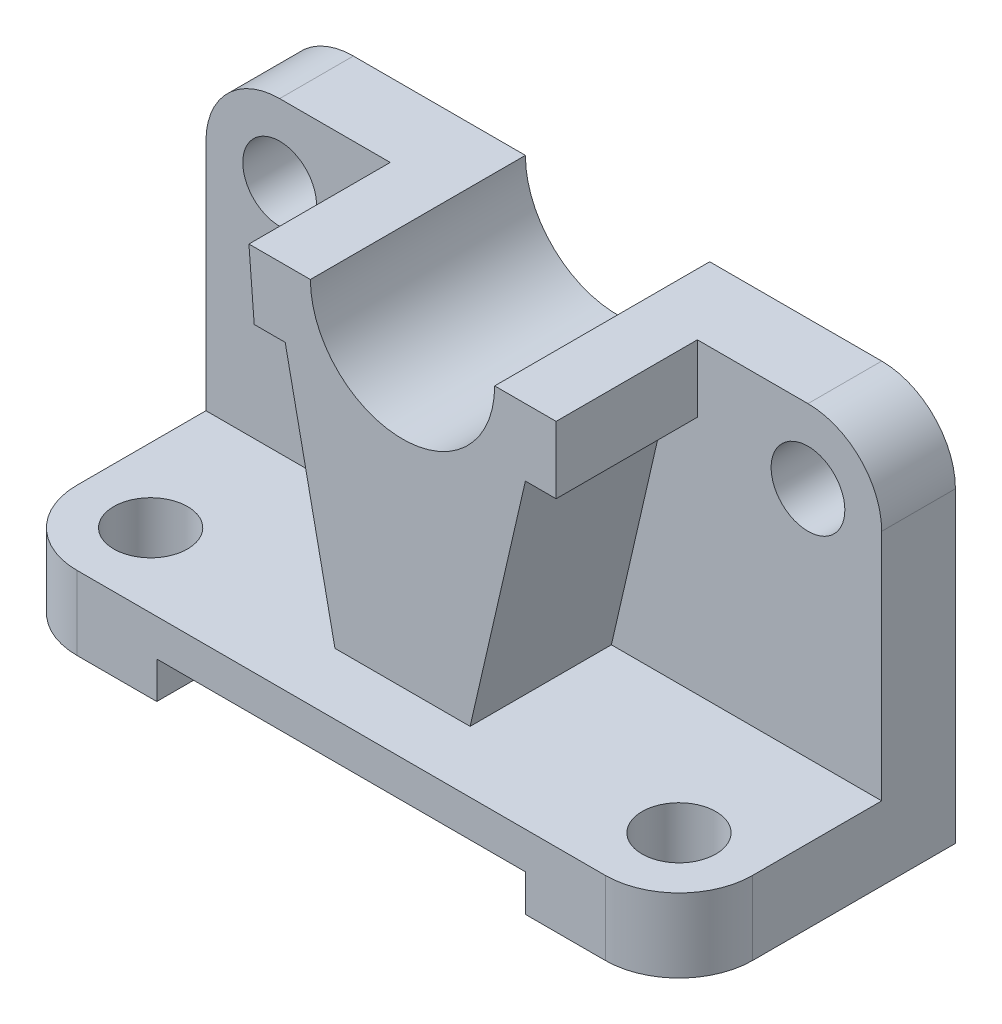
ISO-10303-21;
HEADER;
FILE_DESCRIPTION(('STEP AP214'),'2;1');
FILE_NAME('part.step','',(''),(''),'','','');
FILE_SCHEMA(('AUTOMOTIVE_DESIGN { 1 0 10303 214 1 1 1 1 }'));
ENDSEC;
DATA;
#1=APPLICATION_CONTEXT('core data for automotive mechanical design processes');
#2=APPLICATION_PROTOCOL_DEFINITION('international standard','automotive_design',2000,#1);
#3=PRODUCT_CONTEXT('',#1,'mechanical');
#4=PRODUCT('Part','Part','',(#3));
#5=PRODUCT_RELATED_PRODUCT_CATEGORY('part','',(#4));
#6=PRODUCT_DEFINITION_FORMATION('','',#4);
#7=PRODUCT_DEFINITION_CONTEXT('part definition',#1,'design');
#8=PRODUCT_DEFINITION('design','',#6,#7);
#9=PRODUCT_DEFINITION_SHAPE('','',#8);
#10=(LENGTH_UNIT() NAMED_UNIT(*) SI_UNIT(.MILLI.,.METRE.));
#11=(NAMED_UNIT(*) PLANE_ANGLE_UNIT() SI_UNIT($,.RADIAN.));
#12=(NAMED_UNIT(*) SI_UNIT($,.STERADIAN.) SOLID_ANGLE_UNIT());
#13=UNCERTAINTY_MEASURE_WITH_UNIT(LENGTH_MEASURE(1.E-05),#10,'distance_accuracy_value','');
#14=(GEOMETRIC_REPRESENTATION_CONTEXT(3) GLOBAL_UNCERTAINTY_ASSIGNED_CONTEXT((#13)) GLOBAL_UNIT_ASSIGNED_CONTEXT((#10,
#11,#12)) REPRESENTATION_CONTEXT('',''));
#15=CARTESIAN_POINT('',(0.,0.,0.));
#16=DIRECTION('',(0.,0.,1.));
#17=DIRECTION('',(1.,0.,0.));
#18=AXIS2_PLACEMENT_3D('',#15,#16,#17);
#19=CARTESIAN_POINT('',(110.,-62.,0.));
#20=DIRECTION('',(0.,1.,0.));
#21=DIRECTION('',(0.,0.,1.));
#22=AXIS2_PLACEMENT_3D('',#19,#20,#21);
#23=PLANE('',#22);
#24=CARTESIAN_POINT('',(12.,-62.,33.));
#25=DIRECTION('',(0.,1.,0.));
#26=DIRECTION('',(0.,0.,1.));
#27=AXIS2_PLACEMENT_3D('',#24,#25,#26);
#28=CIRCLE('',#27,6.);
#29=CARTESIAN_POINT('',(12.,-62.,39.));
#30=VERTEX_POINT('',#29);
#31=EDGE_CURVE('E210',#30,#30,#28,.T.);
#32=ORIENTED_EDGE('',*,*,#31,.T.);
#33=EDGE_LOOP('',(#32));
#34=FACE_BOUND('',#33,.T.);
#35=DIRECTION('',(-1.,0.,0.));
#36=VECTOR('',#35,1.);
#37=CARTESIAN_POINT('',(110.,-62.,45.));
#38=LINE('',#37,#36);
#39=CARTESIAN_POINT('',(25.,-62.,45.));
#40=VERTEX_POINT('',#39);
#41=CARTESIAN_POINT('',(12.,-62.,45.));
#42=VERTEX_POINT('',#41);
#43=EDGE_CURVE('E215',#40,#42,#38,.T.);
#44=ORIENTED_EDGE('',*,*,#43,.T.);
#45=CARTESIAN_POINT('',(12.,-62.,33.));
#46=DIRECTION('',(0.,1.,0.));
#47=DIRECTION('',(0.,0.,1.));
#48=AXIS2_PLACEMENT_3D('',#45,#46,#47);
#49=CIRCLE('',#48,12.);
#50=CARTESIAN_POINT('',(0.,-62.,33.));
#51=VERTEX_POINT('',#50);
#52=EDGE_CURVE('E266',#42,#51,#49,.F.);
#53=ORIENTED_EDGE('',*,*,#52,.T.);
#54=DIRECTION('',(0.,0.,-1.));
#55=VECTOR('',#54,1.);
#56=CARTESIAN_POINT('',(0.,-62.,0.));
#57=LINE('',#56,#55);
#58=CARTESIAN_POINT('',(0.,-62.,0.));
#59=VERTEX_POINT('',#58);
#60=EDGE_CURVE('E365',#51,#59,#57,.T.);
#61=ORIENTED_EDGE('',*,*,#60,.T.);
#62=DIRECTION('',(-1.,0.,0.));
#63=VECTOR('',#62,1.);
#64=CARTESIAN_POINT('',(110.,-62.,0.));
#65=LINE('',#64,#63);
#66=CARTESIAN_POINT('',(25.,-62.,0.));
#67=VERTEX_POINT('',#66);
#68=EDGE_CURVE('E217',#67,#59,#65,.T.);
#69=ORIENTED_EDGE('',*,*,#68,.F.);
#70=DIRECTION('',(0.,0.,1.));
#71=VECTOR('',#70,1.);
#72=CARTESIAN_POINT('',(25.,-62.,-108.));
#73=LINE('',#72,#71);
#74=EDGE_CURVE('E201',#67,#40,#73,.T.);
#75=ORIENTED_EDGE('',*,*,#74,.T.);
#76=EDGE_LOOP('',(#44,#53,#61,#69,#75));
#77=FACE_BOUND('',#76,.T.);
#78=ADVANCED_FACE('F39',(#34,#77),#23,.F.);
#79=CARTESIAN_POINT('',(110.,0.,12.));
#80=DIRECTION('',(0.,-1.,0.));
#81=DIRECTION('',(0.,0.,-1.));
#82=AXIS2_PLACEMENT_3D('',#79,#80,#81);
#83=PLANE('',#82);
#84=DIRECTION('',(-1.,0.,0.));
#85=VECTOR('',#84,1.);
#86=CARTESIAN_POINT('',(110.,0.,12.));
#87=LINE('',#86,#85);
#88=CARTESIAN_POINT('',(98.,0.,12.));
#89=VERTEX_POINT('',#88);
#90=CARTESIAN_POINT('',(80.,0.,12.));
#91=VERTEX_POINT('',#90);
#92=EDGE_CURVE('E241',#89,#91,#87,.T.);
#93=ORIENTED_EDGE('',*,*,#92,.F.);
#94=DIRECTION('',(0.,0.,1.));
#95=VECTOR('',#94,1.);
#96=CARTESIAN_POINT('',(98.,0.,12.));
#97=LINE('',#96,#95);
#98=CARTESIAN_POINT('',(98.,0.,0.));
#99=VERTEX_POINT('',#98);
#100=EDGE_CURVE('E280',#89,#99,#97,.F.);
#101=ORIENTED_EDGE('',*,*,#100,.T.);
#102=DIRECTION('',(-1.,0.,0.));
#103=VECTOR('',#102,1.);
#104=CARTESIAN_POINT('',(110.,0.,0.));
#105=LINE('',#104,#103);
#106=CARTESIAN_POINT('',(70.,0.,0.));
#107=VERTEX_POINT('',#106);
#108=EDGE_CURVE('E368',#99,#107,#105,.T.);
#109=ORIENTED_EDGE('',*,*,#108,.T.);
#110=DIRECTION('',(0.,0.,-1.));
#111=VECTOR('',#110,1.);
#112=CARTESIAN_POINT('',(70.,0.,35.));
#113=LINE('',#112,#111);
#114=CARTESIAN_POINT('',(70.,0.,35.));
#115=VERTEX_POINT('',#114);
#116=EDGE_CURVE('E327',#115,#107,#113,.T.);
#117=ORIENTED_EDGE('',*,*,#116,.F.);
#118=DIRECTION('',(-1.,0.,0.));
#119=VECTOR('',#118,1.);
#120=CARTESIAN_POINT('',(70.,0.,35.));
#121=LINE('',#120,#119);
#122=CARTESIAN_POINT('',(80.,0.,35.));
#123=VERTEX_POINT('',#122);
#124=EDGE_CURVE('E391',#123,#115,#121,.T.);
#125=ORIENTED_EDGE('',*,*,#124,.F.);
#126=DIRECTION('',(0.,0.,-1.));
#127=VECTOR('',#126,1.);
#128=CARTESIAN_POINT('',(80.,0.,35.));
#129=LINE('',#128,#127);
#130=EDGE_CURVE('E330',#123,#91,#129,.T.);
#131=ORIENTED_EDGE('',*,*,#130,.T.);
#132=EDGE_LOOP('',(#93,#101,#109,#117,#125,#131));
#133=FACE_BOUND('',#132,.T.);
#134=ADVANCED_FACE('F390',(#133),#83,.F.);
#135=CARTESIAN_POINT('',(110.,-50.,12.));
#136=DIRECTION('',(0.,0.,-1.));
#137=DIRECTION('',(0.,1.,0.));
#138=AXIS2_PLACEMENT_3D('',#135,#136,#137);
#139=PLANE('',#138);
#140=CARTESIAN_POINT('',(12.,-12.,12.));
#141=DIRECTION('',(0.,0.,-1.));
#142=DIRECTION('',(0.,1.,0.));
#143=AXIS2_PLACEMENT_3D('',#140,#141,#142);
#144=CIRCLE('',#143,6.);
#145=CARTESIAN_POINT('',(12.,-6.,12.));
#146=VERTEX_POINT('',#145);
#147=EDGE_CURVE('E423',#146,#146,#144,.T.);
#148=ORIENTED_EDGE('',*,*,#147,.T.);
#149=EDGE_LOOP('',(#148));
#150=FACE_BOUND('',#149,.T.);
#151=CARTESIAN_POINT('',(30.,0.,12.));
#152=VERTEX_POINT('',#151);
#153=CARTESIAN_POINT('',(12.,0.,12.));
#154=VERTEX_POINT('',#153);
#155=EDGE_CURVE('E240',#152,#154,#87,.T.);
#156=ORIENTED_EDGE('',*,*,#155,.T.);
#157=CARTESIAN_POINT('',(12.,-12.,12.));
#158=DIRECTION('',(0.,0.,-1.));
#159=DIRECTION('',(0.,1.,0.));
#160=AXIS2_PLACEMENT_3D('',#157,#158,#159);
#161=CIRCLE('',#160,12.);
#162=CARTESIAN_POINT('',(0.,-12.,12.));
#163=VERTEX_POINT('',#162);
#164=EDGE_CURVE('E48',#154,#163,#161,.F.);
#165=ORIENTED_EDGE('',*,*,#164,.T.);
#166=DIRECTION('',(0.,-1.,0.));
#167=VECTOR('',#166,1.);
#168=CARTESIAN_POINT('',(0.,-50.,12.));
#169=LINE('',#168,#167);
#170=CARTESIAN_POINT('',(0.,-50.,12.));
#171=VERTEX_POINT('',#170);
#172=EDGE_CURVE('E349',#163,#171,#169,.T.);
#173=ORIENTED_EDGE('',*,*,#172,.T.);
#174=DIRECTION('',(-1.,0.,0.));
#175=VECTOR('',#174,1.);
#176=CARTESIAN_POINT('',(110.,-50.,12.));
#177=LINE('',#176,#175);
#178=CARTESIAN_POINT('',(44.,-50.,12.));
#179=VERTEX_POINT('',#178);
#180=EDGE_CURVE('E236',#179,#171,#177,.T.);
#181=ORIENTED_EDGE('',*,*,#180,.F.);
#182=DIRECTION('',(0.202852451167821,-0.979209315241234,0.));
#183=VECTOR('',#182,1.);
#184=CARTESIAN_POINT('',(44.,-50.,12.));
#185=LINE('',#184,#183);
#186=CARTESIAN_POINT('',(35.9028376492862,-10.9133793789853,12.));
#187=VERTEX_POINT('',#186);
#188=EDGE_CURVE('E306',#187,#179,#185,.T.);
#189=ORIENTED_EDGE('',*,*,#188,.F.);
#190=DIRECTION('',(1.,0.,0.));
#191=VECTOR('',#190,1.);
#192=CARTESIAN_POINT('',(35.9028376492862,-10.9133793789853,12.));
#193=LINE('',#192,#191);
#194=CARTESIAN_POINT('',(30.8555150734653,-10.9133793789853,12.));
#195=VERTEX_POINT('',#194);
#196=EDGE_CURVE('E302',#195,#187,#193,.T.);
#197=ORIENTED_EDGE('',*,*,#196,.F.);
#198=DIRECTION('',(0.0781516372618264,-0.996941483535165,0.));
#199=VECTOR('',#198,1.);
#200=CARTESIAN_POINT('',(30.8555150734653,-10.9133793789853,12.));
#201=LINE('',#200,#199);
#202=EDGE_CURVE('E300',#152,#195,#201,.T.);
#203=ORIENTED_EDGE('',*,*,#202,.F.);
#204=EDGE_LOOP('',(#156,#165,#173,#181,#189,#197,#203));
#205=FACE_BOUND('',#204,.T.);
#206=ADVANCED_FACE('F297',(#150,#205),#139,.F.);
#207=CARTESIAN_POINT('',(98.,-12.,12.));
#208=DIRECTION('',(0.,0.,1.));
#209=DIRECTION('',(1.,0.,0.));
#210=AXIS2_PLACEMENT_3D('',#207,#208,#209);
#211=CIRCLE('',#210,6.);
#212=CARTESIAN_POINT('',(104.,-12.,12.));
#213=VERTEX_POINT('',#212);
#214=EDGE_CURVE('E429',#213,#213,#211,.T.);
#215=ORIENTED_EDGE('',*,*,#214,.F.);
#216=EDGE_LOOP('',(#215));
#217=FACE_BOUND('',#216,.T.);
#218=DIRECTION('',(0.,-1.,0.));
#219=VECTOR('',#218,1.);
#220=CARTESIAN_POINT('',(110.,-50.,12.));
#221=LINE('',#220,#219);
#222=CARTESIAN_POINT('',(110.,-12.,12.));
#223=VERTEX_POINT('',#222);
#224=CARTESIAN_POINT('',(110.,-50.,12.));
#225=VERTEX_POINT('',#224);
#226=EDGE_CURVE('E350',#223,#225,#221,.T.);
#227=ORIENTED_EDGE('',*,*,#226,.F.);
#228=CARTESIAN_POINT('',(98.,-12.,12.));
#229=DIRECTION('',(0.,0.,-1.));
#230=DIRECTION('',(0.,1.,0.));
#231=AXIS2_PLACEMENT_3D('',#228,#229,#230);
#232=CIRCLE('',#231,12.);
#233=EDGE_CURVE('E278',#223,#89,#232,.F.);
#234=ORIENTED_EDGE('',*,*,#233,.T.);
#235=ORIENTED_EDGE('',*,*,#92,.T.);
#236=DIRECTION('',(0.,1.,0.));
#237=VECTOR('',#236,1.);
#238=CARTESIAN_POINT('',(80.,0.,12.));
#239=LINE('',#238,#237);
#240=CARTESIAN_POINT('',(80.,-10.9133793789853,12.));
#241=VERTEX_POINT('',#240);
#242=EDGE_CURVE('E319',#241,#91,#239,.T.);
#243=ORIENTED_EDGE('',*,*,#242,.F.);
#244=DIRECTION('',(1.,0.,0.));
#245=VECTOR('',#244,1.);
#246=CARTESIAN_POINT('',(80.,-10.9133793789853,12.));
#247=LINE('',#246,#245);
#248=CARTESIAN_POINT('',(75.,-10.9133793789853,12.));
#249=VERTEX_POINT('',#248);
#250=EDGE_CURVE('E317',#249,#241,#247,.T.);
#251=ORIENTED_EDGE('',*,*,#250,.F.);
#252=DIRECTION('',(0.22438630742042,0.974500274521372,0.));
#253=VECTOR('',#252,1.);
#254=CARTESIAN_POINT('',(75.,-10.9133793789853,12.));
#255=LINE('',#254,#253);
#256=CARTESIAN_POINT('',(66.,-50.,12.));
#257=VERTEX_POINT('',#256);
#258=EDGE_CURVE('E315',#257,#249,#255,.T.);
#259=ORIENTED_EDGE('',*,*,#258,.F.);
#260=EDGE_CURVE('E237',#225,#257,#177,.T.);
#261=ORIENTED_EDGE('',*,*,#260,.F.);
#262=EDGE_LOOP('',(#227,#234,#235,#243,#251,#259,#261));
#263=FACE_BOUND('',#262,.T.);
#264=ADVANCED_FACE('F611',(#217,#263),#139,.F.);
#265=CARTESIAN_POINT('',(110.,-50.,45.));
#266=DIRECTION('',(0.,-1.,0.));
#267=DIRECTION('',(0.,0.,-1.));
#268=AXIS2_PLACEMENT_3D('',#265,#266,#267);
#269=PLANE('',#268);
#270=CARTESIAN_POINT('',(98.,-50.,33.));
#271=DIRECTION('',(0.,-1.,0.));
#272=DIRECTION('',(0.,0.,1.));
#273=AXIS2_PLACEMENT_3D('',#270,#271,#272);
#274=CIRCLE('',#273,6.);
#275=CARTESIAN_POINT('',(98.,-50.,39.));
#276=VERTEX_POINT('',#275);
#277=EDGE_CURVE('E275',#276,#276,#274,.T.);
#278=ORIENTED_EDGE('',*,*,#277,.T.);
#279=EDGE_LOOP('',(#278));
#280=FACE_BOUND('',#279,.T.);
#281=CARTESIAN_POINT('',(12.,-50.,33.));
#282=DIRECTION('',(0.,1.,0.));
#283=DIRECTION('',(0.,0.,1.));
#284=AXIS2_PLACEMENT_3D('',#281,#282,#283);
#285=CIRCLE('',#284,6.);
#286=CARTESIAN_POINT('',(12.,-50.,39.));
#287=VERTEX_POINT('',#286);
#288=EDGE_CURVE('E274',#287,#287,#285,.T.);
#289=ORIENTED_EDGE('',*,*,#288,.F.);
#290=EDGE_LOOP('',(#289));
#291=FACE_BOUND('',#290,.T.);
#292=DIRECTION('',(-1.,0.,0.));
#293=VECTOR('',#292,1.);
#294=CARTESIAN_POINT('',(110.,-50.,45.));
#295=LINE('',#294,#293);
#296=CARTESIAN_POINT('',(98.,-50.,45.));
#297=VERTEX_POINT('',#296);
#298=CARTESIAN_POINT('',(12.,-50.,45.));
#299=VERTEX_POINT('',#298);
#300=EDGE_CURVE('E230',#297,#299,#295,.T.);
#301=ORIENTED_EDGE('',*,*,#300,.F.);
#302=CARTESIAN_POINT('',(98.,-50.,33.));
#303=DIRECTION('',(0.,-1.,0.));
#304=DIRECTION('',(0.,0.,-1.));
#305=AXIS2_PLACEMENT_3D('',#302,#303,#304);
#306=CIRCLE('',#305,12.);
#307=CARTESIAN_POINT('',(110.,-50.,33.));
#308=VERTEX_POINT('',#307);
#309=EDGE_CURVE('E264',#297,#308,#306,.F.);
#310=ORIENTED_EDGE('',*,*,#309,.T.);
#311=DIRECTION('',(0.,0.,1.));
#312=VECTOR('',#311,1.);
#313=CARTESIAN_POINT('',(110.,-50.,45.));
#314=LINE('',#313,#312);
#315=EDGE_CURVE('E352',#225,#308,#314,.T.);
#316=ORIENTED_EDGE('',*,*,#315,.F.);
#317=ORIENTED_EDGE('',*,*,#260,.T.);
#318=DIRECTION('',(0.,0.,-1.));
#319=VECTOR('',#318,1.);
#320=CARTESIAN_POINT('',(66.,-50.,35.));
#321=LINE('',#320,#319);
#322=CARTESIAN_POINT('',(66.,-50.,35.));
#323=VERTEX_POINT('',#322);
#324=EDGE_CURVE('E339',#323,#257,#321,.T.);
#325=ORIENTED_EDGE('',*,*,#324,.F.);
#326=DIRECTION('',(1.,0.,0.));
#327=VECTOR('',#326,1.);
#328=CARTESIAN_POINT('',(66.,-50.,35.));
#329=LINE('',#328,#327);
#330=CARTESIAN_POINT('',(44.,-50.,35.));
#331=VERTEX_POINT('',#330);
#332=EDGE_CURVE('E402',#331,#323,#329,.T.);
#333=ORIENTED_EDGE('',*,*,#332,.F.);
#334=DIRECTION('',(0.,0.,-1.));
#335=VECTOR('',#334,1.);
#336=CARTESIAN_POINT('',(44.,-50.,35.));
#337=LINE('',#336,#335);
#338=EDGE_CURVE('E341',#331,#179,#337,.T.);
#339=ORIENTED_EDGE('',*,*,#338,.T.);
#340=ORIENTED_EDGE('',*,*,#180,.T.);
#341=DIRECTION('',(0.,0.,1.));
#342=VECTOR('',#341,1.);
#343=CARTESIAN_POINT('',(0.,-50.,45.));
#344=LINE('',#343,#342);
#345=CARTESIAN_POINT('',(0.,-50.,33.));
#346=VERTEX_POINT('',#345);
#347=EDGE_CURVE('E362',#171,#346,#344,.T.);
#348=ORIENTED_EDGE('',*,*,#347,.T.);
#349=CARTESIAN_POINT('',(12.,-50.,33.));
#350=DIRECTION('',(0.,-1.,0.));
#351=DIRECTION('',(0.,0.,-1.));
#352=AXIS2_PLACEMENT_3D('',#349,#350,#351);
#353=CIRCLE('',#352,12.);
#354=EDGE_CURVE('E262',#346,#299,#353,.F.);
#355=ORIENTED_EDGE('',*,*,#354,.T.);
#356=EDGE_LOOP('',(#301,#310,#316,#317,#325,#333,#339,#340,#348,#355));
#357=FACE_BOUND('',#356,.T.);
#358=ADVANCED_FACE('F485',(#280,#291,#357),#269,.F.);
#359=CARTESIAN_POINT('',(40.,0.,0.));
#360=VERTEX_POINT('',#359);
#361=CARTESIAN_POINT('',(12.,0.,0.));
#362=VERTEX_POINT('',#361);
#363=EDGE_CURVE('E294',#360,#362,#105,.T.);
#364=ORIENTED_EDGE('',*,*,#363,.T.);
#365=DIRECTION('',(0.,0.,1.));
#366=VECTOR('',#365,1.);
#367=CARTESIAN_POINT('',(12.,0.,12.));
#368=LINE('',#367,#366);
#369=EDGE_CURVE('E286',#362,#154,#368,.T.);
#370=ORIENTED_EDGE('',*,*,#369,.T.);
#371=ORIENTED_EDGE('',*,*,#155,.F.);
#372=DIRECTION('',(0.,0.,-1.));
#373=VECTOR('',#372,1.);
#374=CARTESIAN_POINT('',(30.,0.,35.));
#375=LINE('',#374,#373);
#376=CARTESIAN_POINT('',(30.,0.,35.));
#377=VERTEX_POINT('',#376);
#378=EDGE_CURVE('E323',#377,#152,#375,.T.);
#379=ORIENTED_EDGE('',*,*,#378,.F.);
#380=DIRECTION('',(-1.,0.,0.));
#381=VECTOR('',#380,1.);
#382=CARTESIAN_POINT('',(30.,0.,35.));
#383=LINE('',#382,#381);
#384=CARTESIAN_POINT('',(40.,0.,35.));
#385=VERTEX_POINT('',#384);
#386=EDGE_CURVE('E311',#385,#377,#383,.T.);
#387=ORIENTED_EDGE('',*,*,#386,.F.);
#388=DIRECTION('',(0.,0.,-1.));
#389=VECTOR('',#388,1.);
#390=CARTESIAN_POINT('',(40.,0.,35.));
#391=LINE('',#390,#389);
#392=EDGE_CURVE('E325',#385,#360,#391,.T.);
#393=ORIENTED_EDGE('',*,*,#392,.T.);
#394=EDGE_LOOP('',(#364,#370,#371,#379,#387,#393));
#395=FACE_BOUND('',#394,.T.);
#396=ADVANCED_FACE('F291',(#395),#83,.F.);
#397=CARTESIAN_POINT('',(110.,-62.,45.));
#398=DIRECTION('',(0.,0.,-1.));
#399=DIRECTION('',(-1.,0.,0.));
#400=AXIS2_PLACEMENT_3D('',#397,#398,#399);
#401=PLANE('',#400);
#402=CARTESIAN_POINT('',(98.,-62.,45.));
#403=VERTEX_POINT('',#402);
#404=CARTESIAN_POINT('',(85.,-62.,45.));
#405=VERTEX_POINT('',#404);
#406=EDGE_CURVE('E227',#403,#405,#38,.T.);
#407=ORIENTED_EDGE('',*,*,#406,.F.);
#408=DIRECTION('',(0.,-1.,0.));
#409=VECTOR('',#408,1.);
#410=CARTESIAN_POINT('',(98.,-62.,45.));
#411=LINE('',#410,#409);
#412=EDGE_CURVE('E260',#403,#297,#411,.F.);
#413=ORIENTED_EDGE('',*,*,#412,.T.);
#414=ORIENTED_EDGE('',*,*,#300,.T.);
#415=DIRECTION('',(0.,-1.,0.));
#416=VECTOR('',#415,1.);
#417=CARTESIAN_POINT('',(12.,-62.,45.));
#418=LINE('',#417,#416);
#419=EDGE_CURVE('E226',#299,#42,#418,.T.);
#420=ORIENTED_EDGE('',*,*,#419,.T.);
#421=ORIENTED_EDGE('',*,*,#43,.F.);
#422=DIRECTION('',(0.,-1.,0.));
#423=VECTOR('',#422,1.);
#424=CARTESIAN_POINT('',(25.,-62.,45.));
#425=LINE('',#424,#423);
#426=CARTESIAN_POINT('',(25.,-56.,45.));
#427=VERTEX_POINT('',#426);
#428=EDGE_CURVE('E198',#427,#40,#425,.T.);
#429=ORIENTED_EDGE('',*,*,#428,.F.);
#430=DIRECTION('',(-1.,0.,0.));
#431=VECTOR('',#430,1.);
#432=CARTESIAN_POINT('',(25.,-56.,45.));
#433=LINE('',#432,#431);
#434=CARTESIAN_POINT('',(85.,-56.,45.));
#435=VERTEX_POINT('',#434);
#436=EDGE_CURVE('E219',#435,#427,#433,.T.);
#437=ORIENTED_EDGE('',*,*,#436,.F.);
#438=DIRECTION('',(0.,1.,0.));
#439=VECTOR('',#438,1.);
#440=CARTESIAN_POINT('',(85.,-62.,45.));
#441=LINE('',#440,#439);
#442=EDGE_CURVE('E209',#405,#435,#441,.T.);
#443=ORIENTED_EDGE('',*,*,#442,.F.);
#444=EDGE_LOOP('',(#407,#413,#414,#420,#421,#429,#437,#443));
#445=FACE_BOUND('',#444,.T.);
#446=ADVANCED_FACE('F223',(#445),#401,.F.);
#447=CARTESIAN_POINT('',(98.,-62.,33.));
#448=DIRECTION('',(0.,1.,0.));
#449=DIRECTION('',(0.,0.,1.));
#450=AXIS2_PLACEMENT_3D('',#447,#448,#449);
#451=CIRCLE('',#450,6.);
#452=CARTESIAN_POINT('',(98.,-62.,39.));
#453=VERTEX_POINT('',#452);
#454=EDGE_CURVE('E271',#453,#453,#451,.F.);
#455=ORIENTED_EDGE('',*,*,#454,.F.);
#456=EDGE_LOOP('',(#455));
#457=FACE_BOUND('',#456,.T.);
#458=DIRECTION('',(0.,0.,-1.));
#459=VECTOR('',#458,1.);
#460=CARTESIAN_POINT('',(110.,-62.,0.));
#461=LINE('',#460,#459);
#462=CARTESIAN_POINT('',(110.,-62.,33.));
#463=VERTEX_POINT('',#462);
#464=CARTESIAN_POINT('',(110.,-62.,0.));
#465=VERTEX_POINT('',#464);
#466=EDGE_CURVE('E356',#463,#465,#461,.T.);
#467=ORIENTED_EDGE('',*,*,#466,.F.);
#468=CARTESIAN_POINT('',(98.,-62.,33.));
#469=DIRECTION('',(0.,1.,0.));
#470=DIRECTION('',(0.,0.,1.));
#471=AXIS2_PLACEMENT_3D('',#468,#469,#470);
#472=CIRCLE('',#471,12.);
#473=EDGE_CURVE('E257',#463,#403,#472,.F.);
#474=ORIENTED_EDGE('',*,*,#473,.T.);
#475=ORIENTED_EDGE('',*,*,#406,.T.);
#476=DIRECTION('',(0.,0.,1.));
#477=VECTOR('',#476,1.);
#478=CARTESIAN_POINT('',(85.,-62.,-108.));
#479=LINE('',#478,#477);
#480=CARTESIAN_POINT('',(85.,-62.,0.));
#481=VERTEX_POINT('',#480);
#482=EDGE_CURVE('E218',#481,#405,#479,.T.);
#483=ORIENTED_EDGE('',*,*,#482,.F.);
#484=EDGE_CURVE('E228',#465,#481,#65,.T.);
#485=ORIENTED_EDGE('',*,*,#484,.F.);
#486=EDGE_LOOP('',(#467,#474,#475,#483,#485));
#487=FACE_BOUND('',#486,.T.);
#488=ADVANCED_FACE('F451',(#457,#487),#23,.F.);
#489=CARTESIAN_POINT('',(110.,0.,0.));
#490=DIRECTION('',(0.,0.,1.));
#491=DIRECTION('',(1.,0.,0.));
#492=AXIS2_PLACEMENT_3D('',#489,#490,#491);
#493=PLANE('',#492);
#494=CARTESIAN_POINT('',(98.,-12.,0.));
#495=DIRECTION('',(0.,0.,1.));
#496=DIRECTION('',(1.,0.,0.));
#497=AXIS2_PLACEMENT_3D('',#494,#495,#496);
#498=CIRCLE('',#497,6.);
#499=CARTESIAN_POINT('',(104.,-12.,0.));
#500=VERTEX_POINT('',#499);
#501=EDGE_CURVE('E43',#500,#500,#498,.T.);
#502=ORIENTED_EDGE('',*,*,#501,.T.);
#503=EDGE_LOOP('',(#502));
#504=FACE_BOUND('',#503,.T.);
#505=CARTESIAN_POINT('',(12.,-12.,0.));
#506=DIRECTION('',(0.,0.,-1.));
#507=DIRECTION('',(-1.,0.,0.));
#508=AXIS2_PLACEMENT_3D('',#505,#506,#507);
#509=CIRCLE('',#508,6.);
#510=CARTESIAN_POINT('',(6.,-12.,0.));
#511=VERTEX_POINT('',#510);
#512=EDGE_CURVE('E426',#511,#511,#509,.T.);
#513=ORIENTED_EDGE('',*,*,#512,.F.);
#514=EDGE_LOOP('',(#513));
#515=FACE_BOUND('',#514,.T.);
#516=ORIENTED_EDGE('',*,*,#108,.F.);
#517=CARTESIAN_POINT('',(98.,-12.,0.));
#518=DIRECTION('',(0.,0.,1.));
#519=DIRECTION('',(1.,0.,0.));
#520=AXIS2_PLACEMENT_3D('',#517,#518,#519);
#521=CIRCLE('',#520,12.);
#522=CARTESIAN_POINT('',(110.,-12.,0.));
#523=VERTEX_POINT('',#522);
#524=EDGE_CURVE('E284',#99,#523,#521,.F.);
#525=ORIENTED_EDGE('',*,*,#524,.T.);
#526=DIRECTION('',(0.,1.,0.));
#527=VECTOR('',#526,1.);
#528=CARTESIAN_POINT('',(110.,0.,0.));
#529=LINE('',#528,#527);
#530=EDGE_CURVE('E358',#465,#523,#529,.T.);
#531=ORIENTED_EDGE('',*,*,#530,.F.);
#532=ORIENTED_EDGE('',*,*,#484,.T.);
#533=DIRECTION('',(0.,1.,0.));
#534=VECTOR('',#533,1.);
#535=CARTESIAN_POINT('',(85.,0.,0.));
#536=LINE('',#535,#534);
#537=CARTESIAN_POINT('',(85.,-56.,0.));
#538=VERTEX_POINT('',#537);
#539=EDGE_CURVE('E246',#481,#538,#536,.T.);
#540=ORIENTED_EDGE('',*,*,#539,.T.);
#541=DIRECTION('',(-1.,0.,0.));
#542=VECTOR('',#541,1.);
#543=CARTESIAN_POINT('',(110.,-56.,0.));
#544=LINE('',#543,#542);
#545=CARTESIAN_POINT('',(25.,-56.,0.));
#546=VERTEX_POINT('',#545);
#547=EDGE_CURVE('E249',#538,#546,#544,.T.);
#548=ORIENTED_EDGE('',*,*,#547,.T.);
#549=DIRECTION('',(0.,-1.,0.));
#550=VECTOR('',#549,1.);
#551=CARTESIAN_POINT('',(25.,0.,0.));
#552=LINE('',#551,#550);
#553=EDGE_CURVE('E252',#546,#67,#552,.T.);
#554=ORIENTED_EDGE('',*,*,#553,.T.);
#555=ORIENTED_EDGE('',*,*,#68,.T.);
#556=DIRECTION('',(0.,1.,0.));
#557=VECTOR('',#556,1.);
#558=CARTESIAN_POINT('',(0.,0.,0.));
#559=LINE('',#558,#557);
#560=CARTESIAN_POINT('',(0.,-12.,0.));
#561=VERTEX_POINT('',#560);
#562=EDGE_CURVE('E353',#59,#561,#559,.T.);
#563=ORIENTED_EDGE('',*,*,#562,.T.);
#564=CARTESIAN_POINT('',(12.,-12.,0.));
#565=DIRECTION('',(0.,0.,1.));
#566=DIRECTION('',(1.,0.,0.));
#567=AXIS2_PLACEMENT_3D('',#564,#565,#566);
#568=CIRCLE('',#567,12.);
#569=EDGE_CURVE('E282',#561,#362,#568,.F.);
#570=ORIENTED_EDGE('',*,*,#569,.T.);
#571=ORIENTED_EDGE('',*,*,#363,.F.);
#572=CARTESIAN_POINT('',(55.,0.,0.));
#573=DIRECTION('',(0.,0.,1.));
#574=DIRECTION('',(1.,0.,0.));
#575=AXIS2_PLACEMENT_3D('',#572,#573,#574);
#576=CIRCLE('',#575,15.);
#577=EDGE_CURVE('E243',#360,#107,#576,.T.);
#578=ORIENTED_EDGE('',*,*,#577,.T.);
#579=EDGE_LOOP('',(#516,#525,#531,#532,#540,#548,#554,#555,#563,#570,#571,#578));
#580=FACE_BOUND('',#579,.T.);
#581=ADVANCED_FACE('F374',(#504,#515,#580),#493,.F.);
#582=CARTESIAN_POINT('',(110.,0.,0.));
#583=DIRECTION('',(-1.,0.,0.));
#584=DIRECTION('',(0.,0.,1.));
#585=AXIS2_PLACEMENT_3D('',#582,#583,#584);
#586=PLANE('',#585);
#587=ORIENTED_EDGE('',*,*,#530,.T.);
#588=DIRECTION('',(0.,0.,1.));
#589=VECTOR('',#588,1.);
#590=CARTESIAN_POINT('',(110.,-12.,0.));
#591=LINE('',#590,#589);
#592=EDGE_CURVE('E270',#523,#223,#591,.T.);
#593=ORIENTED_EDGE('',*,*,#592,.T.);
#594=ORIENTED_EDGE('',*,*,#226,.T.);
#595=ORIENTED_EDGE('',*,*,#315,.T.);
#596=DIRECTION('',(0.,-1.,0.));
#597=VECTOR('',#596,1.);
#598=CARTESIAN_POINT('',(110.,0.,33.));
#599=LINE('',#598,#597);
#600=EDGE_CURVE('E254',#308,#463,#599,.T.);
#601=ORIENTED_EDGE('',*,*,#600,.T.);
#602=ORIENTED_EDGE('',*,*,#466,.T.);
#603=EDGE_LOOP('',(#587,#593,#594,#595,#601,#602));
#604=FACE_BOUND('',#603,.T.);
#605=ADVANCED_FACE('F466',(#604),#586,.F.);
#606=CARTESIAN_POINT('',(0.,0.,0.));
#607=DIRECTION('',(-1.,0.,0.));
#608=DIRECTION('',(0.,0.,1.));
#609=AXIS2_PLACEMENT_3D('',#606,#607,#608);
#610=PLANE('',#609);
#611=ORIENTED_EDGE('',*,*,#172,.F.);
#612=DIRECTION('',(0.,0.,1.));
#613=VECTOR('',#612,1.);
#614=CARTESIAN_POINT('',(0.,-12.,0.));
#615=LINE('',#614,#613);
#616=EDGE_CURVE('E11',#163,#561,#615,.F.);
#617=ORIENTED_EDGE('',*,*,#616,.T.);
#618=ORIENTED_EDGE('',*,*,#562,.F.);
#619=ORIENTED_EDGE('',*,*,#60,.F.);
#620=DIRECTION('',(0.,-1.,0.));
#621=VECTOR('',#620,1.);
#622=CARTESIAN_POINT('',(0.,-50.,33.));
#623=LINE('',#622,#621);
#624=EDGE_CURVE('E268',#51,#346,#623,.F.);
#625=ORIENTED_EDGE('',*,*,#624,.T.);
#626=ORIENTED_EDGE('',*,*,#347,.F.);
#627=EDGE_LOOP('',(#611,#617,#618,#619,#625,#626));
#628=FACE_BOUND('',#627,.T.);
#629=ADVANCED_FACE('F377',(#628),#610,.T.);
#630=CARTESIAN_POINT('',(30.8555150734653,-10.9133793789853,35.));
#631=DIRECTION('',(0.996941483535165,0.0781516372618264,0.));
#632=DIRECTION('',(-0.0781516372618264,0.996941483535165,0.));
#633=AXIS2_PLACEMENT_3D('',#630,#631,#632);
#634=PLANE('',#633);
#635=ORIENTED_EDGE('',*,*,#202,.T.);
#636=DIRECTION('',(0.,0.,-1.));
#637=VECTOR('',#636,1.);
#638=CARTESIAN_POINT('',(30.8555150734653,-10.9133793789853,35.));
#639=LINE('',#638,#637);
#640=CARTESIAN_POINT('',(30.8555150734653,-10.9133793789853,35.));
#641=VERTEX_POINT('',#640);
#642=EDGE_CURVE('E347',#641,#195,#639,.T.);
#643=ORIENTED_EDGE('',*,*,#642,.F.);
#644=DIRECTION('',(0.0781516372618264,-0.996941483535165,0.));
#645=VECTOR('',#644,1.);
#646=CARTESIAN_POINT('',(30.8555150734653,-10.9133793789853,35.));
#647=LINE('',#646,#645);
#648=EDGE_CURVE('E322',#377,#641,#647,.T.);
#649=ORIENTED_EDGE('',*,*,#648,.F.);
#650=ORIENTED_EDGE('',*,*,#378,.T.);
#651=EDGE_LOOP('',(#635,#643,#649,#650));
#652=FACE_BOUND('',#651,.T.);
#653=ADVANCED_FACE('F547',(#652),#634,.F.);
#654=CARTESIAN_POINT('',(35.9028376492862,-10.9133793789853,35.));
#655=DIRECTION('',(0.,1.,0.));
#656=DIRECTION('',(0.,0.,1.));
#657=AXIS2_PLACEMENT_3D('',#654,#655,#656);
#658=PLANE('',#657);
#659=ORIENTED_EDGE('',*,*,#196,.T.);
#660=DIRECTION('',(0.,0.,-1.));
#661=VECTOR('',#660,1.);
#662=CARTESIAN_POINT('',(35.9028376492862,-10.9133793789853,35.));
#663=LINE('',#662,#661);
#664=CARTESIAN_POINT('',(35.9028376492862,-10.9133793789853,35.));
#665=VERTEX_POINT('',#664);
#666=EDGE_CURVE('E344',#665,#187,#663,.T.);
#667=ORIENTED_EDGE('',*,*,#666,.F.);
#668=DIRECTION('',(1.,0.,0.));
#669=VECTOR('',#668,1.);
#670=CARTESIAN_POINT('',(35.9028376492862,-10.9133793789853,35.));
#671=LINE('',#670,#669);
#672=EDGE_CURVE('E407',#641,#665,#671,.T.);
#673=ORIENTED_EDGE('',*,*,#672,.F.);
#674=ORIENTED_EDGE('',*,*,#642,.T.);
#675=EDGE_LOOP('',(#659,#667,#673,#674));
#676=FACE_BOUND('',#675,.T.);
#677=ADVANCED_FACE('F543',(#676),#658,.F.);
#678=CARTESIAN_POINT('',(44.,-50.,35.));
#679=DIRECTION('',(0.979209315241234,0.202852451167821,0.));
#680=DIRECTION('',(-0.202852451167821,0.979209315241234,0.));
#681=AXIS2_PLACEMENT_3D('',#678,#679,#680);
#682=PLANE('',#681);
#683=ORIENTED_EDGE('',*,*,#188,.T.);
#684=ORIENTED_EDGE('',*,*,#338,.F.);
#685=DIRECTION('',(0.202852451167821,-0.979209315241234,0.));
#686=VECTOR('',#685,1.);
#687=CARTESIAN_POINT('',(44.,-50.,35.));
#688=LINE('',#687,#686);
#689=EDGE_CURVE('E404',#665,#331,#688,.T.);
#690=ORIENTED_EDGE('',*,*,#689,.F.);
#691=ORIENTED_EDGE('',*,*,#666,.T.);
#692=EDGE_LOOP('',(#683,#684,#690,#691));
#693=FACE_BOUND('',#692,.T.);
#694=ADVANCED_FACE('F539',(#693),#682,.F.);
#695=CARTESIAN_POINT('',(75.,-10.9133793789853,35.));
#696=DIRECTION('',(-0.974500274521372,0.22438630742042,0.));
#697=DIRECTION('',(-0.22438630742042,-0.974500274521372,0.));
#698=AXIS2_PLACEMENT_3D('',#695,#696,#697);
#699=PLANE('',#698);
#700=ORIENTED_EDGE('',*,*,#258,.T.);
#701=DIRECTION('',(0.,0.,-1.));
#702=VECTOR('',#701,1.);
#703=CARTESIAN_POINT('',(75.,-10.9133793789853,35.));
#704=LINE('',#703,#702);
#705=CARTESIAN_POINT('',(75.,-10.9133793789853,35.));
#706=VERTEX_POINT('',#705);
#707=EDGE_CURVE('E336',#706,#249,#704,.T.);
#708=ORIENTED_EDGE('',*,*,#707,.F.);
#709=DIRECTION('',(0.22438630742042,0.974500274521372,0.));
#710=VECTOR('',#709,1.);
#711=CARTESIAN_POINT('',(75.,-10.9133793789853,35.));
#712=LINE('',#711,#710);
#713=EDGE_CURVE('E400',#323,#706,#712,.T.);
#714=ORIENTED_EDGE('',*,*,#713,.F.);
#715=ORIENTED_EDGE('',*,*,#324,.T.);
#716=EDGE_LOOP('',(#700,#708,#714,#715));
#717=FACE_BOUND('',#716,.T.);
#718=ADVANCED_FACE('F535',(#717),#699,.F.);
#719=CARTESIAN_POINT('',(80.,-10.9133793789853,35.));
#720=DIRECTION('',(0.,1.,0.));
#721=DIRECTION('',(0.,0.,1.));
#722=AXIS2_PLACEMENT_3D('',#719,#720,#721);
#723=PLANE('',#722);
#724=ORIENTED_EDGE('',*,*,#250,.T.);
#725=DIRECTION('',(0.,0.,-1.));
#726=VECTOR('',#725,1.);
#727=CARTESIAN_POINT('',(80.,-10.9133793789853,35.));
#728=LINE('',#727,#726);
#729=CARTESIAN_POINT('',(80.,-10.9133793789853,35.));
#730=VERTEX_POINT('',#729);
#731=EDGE_CURVE('E333',#730,#241,#728,.T.);
#732=ORIENTED_EDGE('',*,*,#731,.F.);
#733=DIRECTION('',(1.,0.,0.));
#734=VECTOR('',#733,1.);
#735=CARTESIAN_POINT('',(80.,-10.9133793789853,35.));
#736=LINE('',#735,#734);
#737=EDGE_CURVE('E396',#706,#730,#736,.T.);
#738=ORIENTED_EDGE('',*,*,#737,.F.);
#739=ORIENTED_EDGE('',*,*,#707,.T.);
#740=EDGE_LOOP('',(#724,#732,#738,#739));
#741=FACE_BOUND('',#740,.T.);
#742=ADVANCED_FACE('F531',(#741),#723,.F.);
#743=CARTESIAN_POINT('',(80.,0.,35.));
#744=DIRECTION('',(-1.,0.,0.));
#745=DIRECTION('',(0.,0.,1.));
#746=AXIS2_PLACEMENT_3D('',#743,#744,#745);
#747=PLANE('',#746);
#748=ORIENTED_EDGE('',*,*,#242,.T.);
#749=ORIENTED_EDGE('',*,*,#130,.F.);
#750=DIRECTION('',(0.,1.,0.));
#751=VECTOR('',#750,1.);
#752=CARTESIAN_POINT('',(80.,0.,35.));
#753=LINE('',#752,#751);
#754=EDGE_CURVE('E394',#730,#123,#753,.T.);
#755=ORIENTED_EDGE('',*,*,#754,.F.);
#756=ORIENTED_EDGE('',*,*,#731,.T.);
#757=EDGE_LOOP('',(#748,#749,#755,#756));
#758=FACE_BOUND('',#757,.T.);
#759=ADVANCED_FACE('F528',(#758),#747,.F.);
#760=CARTESIAN_POINT('',(55.,0.,35.));
#761=DIRECTION('',(0.,0.,-1.));
#762=DIRECTION('',(-1.,0.,0.));
#763=AXIS2_PLACEMENT_3D('',#760,#761,#762);
#764=CYLINDRICAL_SURFACE('',#763,15.);
#765=ORIENTED_EDGE('',*,*,#116,.T.);
#766=ORIENTED_EDGE('',*,*,#577,.F.);
#767=ORIENTED_EDGE('',*,*,#392,.F.);
#768=CARTESIAN_POINT('',(55.,0.,35.));
#769=DIRECTION('',(0.,0.,-1.));
#770=DIRECTION('',(1.,0.,0.));
#771=AXIS2_PLACEMENT_3D('',#768,#769,#770);
#772=CIRCLE('',#771,15.);
#773=EDGE_CURVE('E387',#115,#385,#772,.T.);
#774=ORIENTED_EDGE('',*,*,#773,.F.);
#775=EDGE_LOOP('',(#765,#766,#767,#774));
#776=FACE_BOUND('',#775,.T.);
#777=ADVANCED_FACE('F384',(#776),#764,.F.);
#778=CARTESIAN_POINT('',(55.,0.,35.));
#779=DIRECTION('',(0.,0.,1.));
#780=DIRECTION('',(1.,0.,0.));
#781=AXIS2_PLACEMENT_3D('',#778,#779,#780);
#782=PLANE('',#781);
#783=ORIENTED_EDGE('',*,*,#648,.T.);
#784=ORIENTED_EDGE('',*,*,#672,.T.);
#785=ORIENTED_EDGE('',*,*,#689,.T.);
#786=ORIENTED_EDGE('',*,*,#332,.T.);
#787=ORIENTED_EDGE('',*,*,#713,.T.);
#788=ORIENTED_EDGE('',*,*,#737,.T.);
#789=ORIENTED_EDGE('',*,*,#754,.T.);
#790=ORIENTED_EDGE('',*,*,#124,.T.);
#791=ORIENTED_EDGE('',*,*,#773,.T.);
#792=ORIENTED_EDGE('',*,*,#386,.T.);
#793=EDGE_LOOP('',(#783,#784,#785,#786,#787,#788,#789,#790,#791,#792));
#794=FACE_BOUND('',#793,.T.);
#795=ADVANCED_FACE('F521',(#794),#782,.T.);
#796=CARTESIAN_POINT('',(25.,-62.,-108.));
#797=DIRECTION('',(-1.,0.,0.));
#798=DIRECTION('',(0.,0.,1.));
#799=AXIS2_PLACEMENT_3D('',#796,#797,#798);
#800=PLANE('',#799);
#801=DIRECTION('',(0.,0.,1.));
#802=VECTOR('',#801,1.);
#803=CARTESIAN_POINT('',(25.,-56.,-108.));
#804=LINE('',#803,#802);
#805=EDGE_CURVE('E204',#546,#427,#804,.T.);
#806=ORIENTED_EDGE('',*,*,#805,.T.);
#807=ORIENTED_EDGE('',*,*,#428,.T.);
#808=ORIENTED_EDGE('',*,*,#74,.F.);
#809=ORIENTED_EDGE('',*,*,#553,.F.);
#810=EDGE_LOOP('',(#806,#807,#808,#809));
#811=FACE_BOUND('',#810,.T.);
#812=ADVANCED_FACE('F200',(#811),#800,.F.);
#813=CARTESIAN_POINT('',(25.,-56.,-108.));
#814=DIRECTION('',(0.,1.,0.));
#815=DIRECTION('',(0.,0.,1.));
#816=AXIS2_PLACEMENT_3D('',#813,#814,#815);
#817=PLANE('',#816);
#818=DIRECTION('',(0.,0.,1.));
#819=VECTOR('',#818,1.);
#820=CARTESIAN_POINT('',(85.,-56.,-108.));
#821=LINE('',#820,#819);
#822=EDGE_CURVE('E308',#538,#435,#821,.T.);
#823=ORIENTED_EDGE('',*,*,#822,.T.);
#824=ORIENTED_EDGE('',*,*,#436,.T.);
#825=ORIENTED_EDGE('',*,*,#805,.F.);
#826=ORIENTED_EDGE('',*,*,#547,.F.);
#827=EDGE_LOOP('',(#823,#824,#825,#826));
#828=FACE_BOUND('',#827,.T.);
#829=ADVANCED_FACE('F513',(#828),#817,.F.);
#830=CARTESIAN_POINT('',(85.,-62.,-108.));
#831=DIRECTION('',(1.,0.,0.));
#832=DIRECTION('',(0.,0.,-1.));
#833=AXIS2_PLACEMENT_3D('',#830,#831,#832);
#834=PLANE('',#833);
#835=ORIENTED_EDGE('',*,*,#482,.T.);
#836=ORIENTED_EDGE('',*,*,#442,.T.);
#837=ORIENTED_EDGE('',*,*,#822,.F.);
#838=ORIENTED_EDGE('',*,*,#539,.F.);
#839=EDGE_LOOP('',(#835,#836,#837,#838));
#840=FACE_BOUND('',#839,.T.);
#841=ADVANCED_FACE('F498',(#840),#834,.F.);
#842=CARTESIAN_POINT('',(98.,0.,33.));
#843=DIRECTION('',(0.,-1.,0.));
#844=DIRECTION('',(0.,0.,-1.));
#845=AXIS2_PLACEMENT_3D('',#842,#843,#844);
#846=CYLINDRICAL_SURFACE('',#845,12.);
#847=ORIENTED_EDGE('',*,*,#309,.F.);
#848=ORIENTED_EDGE('',*,*,#412,.F.);
#849=ORIENTED_EDGE('',*,*,#473,.F.);
#850=ORIENTED_EDGE('',*,*,#600,.F.);
#851=EDGE_LOOP('',(#847,#848,#849,#850));
#852=FACE_BOUND('',#851,.T.);
#853=ADVANCED_FACE('F480',(#852),#846,.T.);
#854=CARTESIAN_POINT('',(12.,-62.,33.));
#855=DIRECTION('',(0.,1.,0.));
#856=DIRECTION('',(0.,0.,1.));
#857=AXIS2_PLACEMENT_3D('',#854,#855,#856);
#858=CYLINDRICAL_SURFACE('',#857,12.);
#859=ORIENTED_EDGE('',*,*,#354,.F.);
#860=ORIENTED_EDGE('',*,*,#624,.F.);
#861=ORIENTED_EDGE('',*,*,#52,.F.);
#862=ORIENTED_EDGE('',*,*,#419,.F.);
#863=EDGE_LOOP('',(#859,#860,#861,#862));
#864=FACE_BOUND('',#863,.T.);
#865=ADVANCED_FACE('F489',(#864),#858,.T.);
#866=CARTESIAN_POINT('',(12.,-203.,33.));
#867=DIRECTION('',(0.,1.,0.));
#868=DIRECTION('',(0.,0.,1.));
#869=AXIS2_PLACEMENT_3D('',#866,#867,#868);
#870=CYLINDRICAL_SURFACE('',#869,6.);
#871=ORIENTED_EDGE('',*,*,#288,.T.);
#872=EDGE_LOOP('',(#871));
#873=FACE_BOUND('',#872,.T.);
#874=ORIENTED_EDGE('',*,*,#31,.F.);
#875=EDGE_LOOP('',(#874));
#876=FACE_BOUND('',#875,.T.);
#877=ADVANCED_FACE('F490',(#873,#876),#870,.F.);
#878=CARTESIAN_POINT('',(98.,-203.,33.));
#879=DIRECTION('',(0.,1.,0.));
#880=DIRECTION('',(0.,0.,1.));
#881=AXIS2_PLACEMENT_3D('',#878,#879,#880);
#882=CYLINDRICAL_SURFACE('',#881,6.);
#883=ORIENTED_EDGE('',*,*,#277,.F.);
#884=EDGE_LOOP('',(#883));
#885=FACE_BOUND('',#884,.T.);
#886=ORIENTED_EDGE('',*,*,#454,.T.);
#887=EDGE_LOOP('',(#886));
#888=FACE_BOUND('',#887,.T.);
#889=ADVANCED_FACE('F495',(#885,#888),#882,.F.);
#890=CARTESIAN_POINT('',(98.,-12.,0.));
#891=DIRECTION('',(0.,0.,1.));
#892=DIRECTION('',(1.,0.,0.));
#893=AXIS2_PLACEMENT_3D('',#890,#891,#892);
#894=CYLINDRICAL_SURFACE('',#893,12.);
#895=ORIENTED_EDGE('',*,*,#524,.F.);
#896=ORIENTED_EDGE('',*,*,#100,.F.);
#897=ORIENTED_EDGE('',*,*,#233,.F.);
#898=ORIENTED_EDGE('',*,*,#592,.F.);
#899=EDGE_LOOP('',(#895,#896,#897,#898));
#900=FACE_BOUND('',#899,.T.);
#901=ADVANCED_FACE('F500',(#900),#894,.T.);
#902=CARTESIAN_POINT('',(12.,-12.,12.));
#903=DIRECTION('',(0.,0.,-1.));
#904=DIRECTION('',(-1.,0.,0.));
#905=AXIS2_PLACEMENT_3D('',#902,#903,#904);
#906=CYLINDRICAL_SURFACE('',#905,12.);
#907=ORIENTED_EDGE('',*,*,#569,.F.);
#908=ORIENTED_EDGE('',*,*,#616,.F.);
#909=ORIENTED_EDGE('',*,*,#164,.F.);
#910=ORIENTED_EDGE('',*,*,#369,.F.);
#911=EDGE_LOOP('',(#907,#908,#909,#910));
#912=FACE_BOUND('',#911,.T.);
#913=ADVANCED_FACE('F41',(#912),#906,.T.);
#914=CARTESIAN_POINT('',(12.,-12.,153.));
#915=DIRECTION('',(0.,0.,-1.));
#916=DIRECTION('',(-1.,0.,0.));
#917=AXIS2_PLACEMENT_3D('',#914,#915,#916);
#918=CYLINDRICAL_SURFACE('',#917,6.);
#919=ORIENTED_EDGE('',*,*,#512,.T.);
#920=EDGE_LOOP('',(#919));
#921=FACE_BOUND('',#920,.T.);
#922=ORIENTED_EDGE('',*,*,#147,.F.);
#923=EDGE_LOOP('',(#922));
#924=FACE_BOUND('',#923,.T.);
#925=ADVANCED_FACE('F440',(#921,#924),#918,.F.);
#926=CARTESIAN_POINT('',(98.,-12.,-141.));
#927=DIRECTION('',(0.,0.,1.));
#928=DIRECTION('',(1.,0.,0.));
#929=AXIS2_PLACEMENT_3D('',#926,#927,#928);
#930=CYLINDRICAL_SURFACE('',#929,6.);
#931=ORIENTED_EDGE('',*,*,#214,.T.);
#932=EDGE_LOOP('',(#931));
#933=FACE_BOUND('',#932,.T.);
#934=ORIENTED_EDGE('',*,*,#501,.F.);
#935=EDGE_LOOP('',(#934));
#936=FACE_BOUND('',#935,.T.);
#937=ADVANCED_FACE('F438',(#933,#936),#930,.F.);
#938=CLOSED_SHELL('',(#78,#134,#206,#264,#358,#396,#446,#488,#581,#605,#629,#653,#677,#694,#718,
#742,#759,#777,#795,#812,#829,#841,#853,#865,#877,#889,#901,#913,#925,#937));
#939=MANIFOLD_SOLID_BREP('B2',#938);
#940=ADVANCED_BREP_SHAPE_REPRESENTATION('',(#18,#939),#14);
#941=SHAPE_DEFINITION_REPRESENTATION(#9,#940);
ENDSEC;
END-ISO-10303-21;
